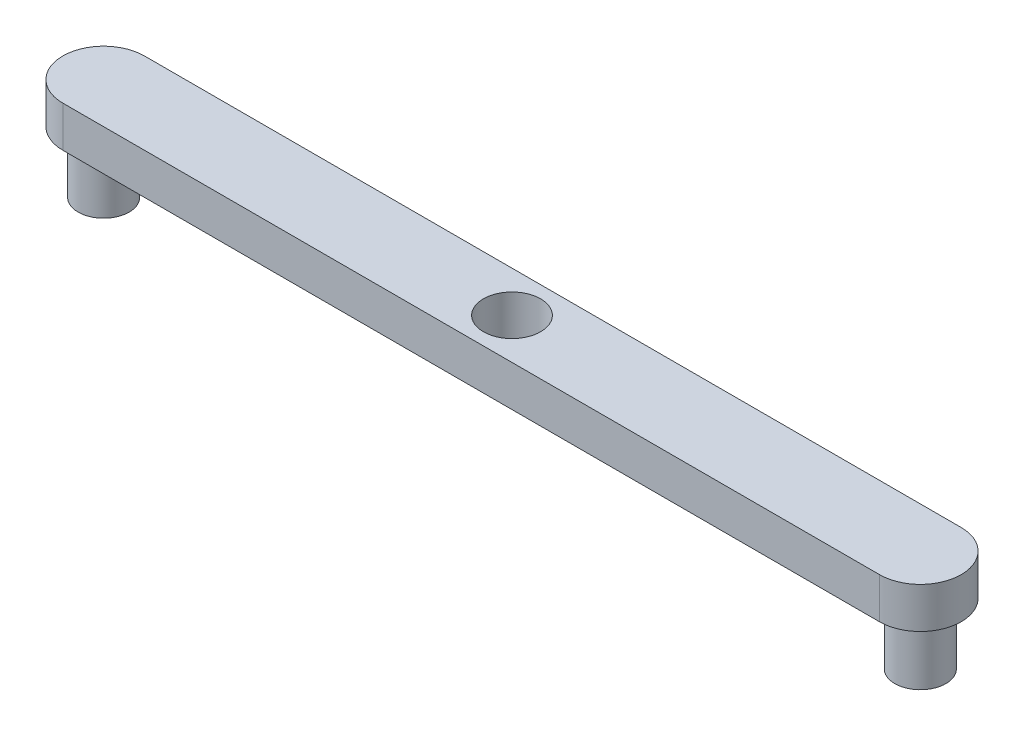
ISO-10303-21;
HEADER;
FILE_DESCRIPTION(('STEP AP214'),'2;1');
FILE_NAME('part.step','',(''),(''),'','','');
FILE_SCHEMA(('AUTOMOTIVE_DESIGN { 1 0 10303 214 1 1 1 1 }'));
ENDSEC;
DATA;
#1=APPLICATION_CONTEXT('core data for automotive mechanical design processes');
#2=APPLICATION_PROTOCOL_DEFINITION('international standard','automotive_design',2000,#1);
#3=PRODUCT_CONTEXT('',#1,'mechanical');
#4=PRODUCT('Part','Part','',(#3));
#5=PRODUCT_RELATED_PRODUCT_CATEGORY('part','',(#4));
#6=PRODUCT_DEFINITION_FORMATION('','',#4);
#7=PRODUCT_DEFINITION_CONTEXT('part definition',#1,'design');
#8=PRODUCT_DEFINITION('design','',#6,#7);
#9=PRODUCT_DEFINITION_SHAPE('','',#8);
#10=(LENGTH_UNIT() NAMED_UNIT(*) SI_UNIT(.MILLI.,.METRE.));
#11=(NAMED_UNIT(*) PLANE_ANGLE_UNIT() SI_UNIT($,.RADIAN.));
#12=(NAMED_UNIT(*) SI_UNIT($,.STERADIAN.) SOLID_ANGLE_UNIT());
#13=UNCERTAINTY_MEASURE_WITH_UNIT(LENGTH_MEASURE(1.E-05),#10,'distance_accuracy_value','');
#14=(GEOMETRIC_REPRESENTATION_CONTEXT(3) GLOBAL_UNCERTAINTY_ASSIGNED_CONTEXT((#13)) GLOBAL_UNIT_ASSIGNED_CONTEXT((#10,
#11,#12)) REPRESENTATION_CONTEXT('',''));
#15=CARTESIAN_POINT('',(0.,0.,0.));
#16=DIRECTION('',(0.,0.,1.));
#17=DIRECTION('',(1.,0.,0.));
#18=AXIS2_PLACEMENT_3D('',#15,#16,#17);
#19=CARTESIAN_POINT('',(-50.8,5.08,0.));
#20=DIRECTION('',(0.,-1.,0.));
#21=DIRECTION('',(0.,0.,-1.));
#22=AXIS2_PLACEMENT_3D('',#19,#20,#21);
#23=CYLINDRICAL_SURFACE('',#22,5.08);
#24=CARTESIAN_POINT('',(-50.8,0.,0.));
#25=DIRECTION('',(0.,1.,0.));
#26=DIRECTION('',(0.,0.,1.));
#27=AXIS2_PLACEMENT_3D('',#24,#25,#26);
#28=CIRCLE('',#27,5.08);
#29=CARTESIAN_POINT('',(-50.8,0.,-5.08));
#30=VERTEX_POINT('',#29);
#31=CARTESIAN_POINT('',(-50.8,0.,5.08));
#32=VERTEX_POINT('',#31);
#33=EDGE_CURVE('E102',#30,#32,#28,.T.);
#34=ORIENTED_EDGE('',*,*,#33,.T.);
#35=DIRECTION('',(0.,-1.,0.));
#36=VECTOR('',#35,1.);
#37=CARTESIAN_POINT('',(-50.8,5.08,5.08));
#38=LINE('',#37,#36);
#39=CARTESIAN_POINT('',(-50.8,5.08,5.08));
#40=VERTEX_POINT('',#39);
#41=EDGE_CURVE('E93',#40,#32,#38,.T.);
#42=ORIENTED_EDGE('',*,*,#41,.F.);
#43=CARTESIAN_POINT('',(-50.8,5.08,0.));
#44=DIRECTION('',(0.,1.,0.));
#45=DIRECTION('',(0.,0.,1.));
#46=AXIS2_PLACEMENT_3D('',#43,#44,#45);
#47=CIRCLE('',#46,5.08);
#48=CARTESIAN_POINT('',(-50.8,5.08,-5.08));
#49=VERTEX_POINT('',#48);
#50=EDGE_CURVE('E87',#49,#40,#47,.T.);
#51=ORIENTED_EDGE('',*,*,#50,.F.);
#52=DIRECTION('',(0.,-1.,0.));
#53=VECTOR('',#52,1.);
#54=CARTESIAN_POINT('',(-50.8,5.08,-5.08));
#55=LINE('',#54,#53);
#56=EDGE_CURVE('E98',#49,#30,#55,.T.);
#57=ORIENTED_EDGE('',*,*,#56,.T.);
#58=EDGE_LOOP('',(#34,#42,#51,#57));
#59=FACE_BOUND('',#58,.T.);
#60=ADVANCED_FACE('F35',(#59),#23,.T.);
#61=CARTESIAN_POINT('',(-50.8,5.08,5.08));
#62=DIRECTION('',(0.,0.,-1.));
#63=DIRECTION('',(-1.,0.,0.));
#64=AXIS2_PLACEMENT_3D('',#61,#62,#63);
#65=PLANE('',#64);
#66=DIRECTION('',(1.,0.,0.));
#67=VECTOR('',#66,1.);
#68=CARTESIAN_POINT('',(-50.8,0.,5.08));
#69=LINE('',#68,#67);
#70=CARTESIAN_POINT('',(50.8,0.,5.08));
#71=VERTEX_POINT('',#70);
#72=EDGE_CURVE('E92',#32,#71,#69,.T.);
#73=ORIENTED_EDGE('',*,*,#72,.T.);
#74=DIRECTION('',(0.,-1.,0.));
#75=VECTOR('',#74,1.);
#76=CARTESIAN_POINT('',(50.8,5.08,5.08));
#77=LINE('',#76,#75);
#78=CARTESIAN_POINT('',(50.8,5.08,5.08));
#79=VERTEX_POINT('',#78);
#80=EDGE_CURVE('E90',#79,#71,#77,.T.);
#81=ORIENTED_EDGE('',*,*,#80,.F.);
#82=DIRECTION('',(1.,0.,0.));
#83=VECTOR('',#82,1.);
#84=CARTESIAN_POINT('',(-50.8,5.08,5.08));
#85=LINE('',#84,#83);
#86=EDGE_CURVE('E82',#40,#79,#85,.T.);
#87=ORIENTED_EDGE('',*,*,#86,.F.);
#88=ORIENTED_EDGE('',*,*,#41,.T.);
#89=EDGE_LOOP('',(#73,#81,#87,#88));
#90=FACE_BOUND('',#89,.T.);
#91=ADVANCED_FACE('F91',(#90),#65,.F.);
#92=CARTESIAN_POINT('',(50.8,5.08,0.));
#93=DIRECTION('',(0.,-1.,0.));
#94=DIRECTION('',(0.,0.,-1.));
#95=AXIS2_PLACEMENT_3D('',#92,#93,#94);
#96=CYLINDRICAL_SURFACE('',#95,5.08);
#97=CARTESIAN_POINT('',(50.8,0.,0.));
#98=DIRECTION('',(0.,1.,0.));
#99=DIRECTION('',(0.,0.,1.));
#100=AXIS2_PLACEMENT_3D('',#97,#98,#99);
#101=CIRCLE('',#100,5.08);
#102=CARTESIAN_POINT('',(50.8,0.,-5.08));
#103=VERTEX_POINT('',#102);
#104=EDGE_CURVE('E68',#71,#103,#101,.T.);
#105=ORIENTED_EDGE('',*,*,#104,.T.);
#106=DIRECTION('',(0.,-1.,0.));
#107=VECTOR('',#106,1.);
#108=CARTESIAN_POINT('',(50.8,5.08,-5.08));
#109=LINE('',#108,#107);
#110=CARTESIAN_POINT('',(50.8,5.08,-5.08));
#111=VERTEX_POINT('',#110);
#112=EDGE_CURVE('E94',#111,#103,#109,.T.);
#113=ORIENTED_EDGE('',*,*,#112,.F.);
#114=CARTESIAN_POINT('',(50.8,5.08,0.));
#115=DIRECTION('',(0.,1.,0.));
#116=DIRECTION('',(0.,0.,1.));
#117=AXIS2_PLACEMENT_3D('',#114,#115,#116);
#118=CIRCLE('',#117,5.08);
#119=EDGE_CURVE('E85',#79,#111,#118,.T.);
#120=ORIENTED_EDGE('',*,*,#119,.F.);
#121=ORIENTED_EDGE('',*,*,#80,.T.);
#122=EDGE_LOOP('',(#105,#113,#120,#121));
#123=FACE_BOUND('',#122,.T.);
#124=ADVANCED_FACE('F96',(#123),#96,.T.);
#125=CARTESIAN_POINT('',(-50.8,5.08,-5.08));
#126=DIRECTION('',(0.,0.,1.));
#127=DIRECTION('',(1.,0.,0.));
#128=AXIS2_PLACEMENT_3D('',#125,#126,#127);
#129=PLANE('',#128);
#130=DIRECTION('',(-1.,0.,0.));
#131=VECTOR('',#130,1.);
#132=CARTESIAN_POINT('',(-50.8,0.,-5.08));
#133=LINE('',#132,#131);
#134=EDGE_CURVE('E74',#103,#30,#133,.T.);
#135=ORIENTED_EDGE('',*,*,#134,.T.);
#136=ORIENTED_EDGE('',*,*,#56,.F.);
#137=DIRECTION('',(-1.,0.,0.));
#138=VECTOR('',#137,1.);
#139=CARTESIAN_POINT('',(-50.8,5.08,-5.08));
#140=LINE('',#139,#138);
#141=EDGE_CURVE('E51',#111,#49,#140,.T.);
#142=ORIENTED_EDGE('',*,*,#141,.F.);
#143=ORIENTED_EDGE('',*,*,#112,.T.);
#144=EDGE_LOOP('',(#135,#136,#142,#143));
#145=FACE_BOUND('',#144,.T.);
#146=ADVANCED_FACE('F123',(#145),#129,.F.);
#147=CARTESIAN_POINT('',(-50.8,5.08,0.));
#148=DIRECTION('',(0.,1.,0.));
#149=DIRECTION('',(0.,0.,1.));
#150=AXIS2_PLACEMENT_3D('',#147,#148,#149);
#151=PLANE('',#150);
#152=CARTESIAN_POINT('',(0.,5.08,0.));
#153=DIRECTION('',(0.,1.,0.));
#154=DIRECTION('',(0.,0.,1.));
#155=AXIS2_PLACEMENT_3D('',#152,#153,#154);
#156=CIRCLE('',#155,3.556);
#157=CARTESIAN_POINT('',(0.,5.08,3.556));
#158=VERTEX_POINT('',#157);
#159=EDGE_CURVE('E215',#158,#158,#156,.T.);
#160=ORIENTED_EDGE('',*,*,#159,.F.);
#161=EDGE_LOOP('',(#160));
#162=FACE_BOUND('',#161,.T.);
#163=ORIENTED_EDGE('',*,*,#50,.T.);
#164=ORIENTED_EDGE('',*,*,#86,.T.);
#165=ORIENTED_EDGE('',*,*,#119,.T.);
#166=ORIENTED_EDGE('',*,*,#141,.T.);
#167=EDGE_LOOP('',(#163,#164,#165,#166));
#168=FACE_BOUND('',#167,.T.);
#169=ADVANCED_FACE('F83',(#162,#168),#151,.T.);
#170=CARTESIAN_POINT('',(-50.8,0.,0.));
#171=DIRECTION('',(0.,1.,0.));
#172=DIRECTION('',(0.,0.,1.));
#173=AXIS2_PLACEMENT_3D('',#170,#171,#172);
#174=PLANE('',#173);
#175=CARTESIAN_POINT('',(0.,0.,0.));
#176=DIRECTION('',(0.,1.,0.));
#177=DIRECTION('',(0.,0.,1.));
#178=AXIS2_PLACEMENT_3D('',#175,#176,#177);
#179=CIRCLE('',#178,3.556);
#180=CARTESIAN_POINT('',(0.,0.,3.556));
#181=VERTEX_POINT('',#180);
#182=EDGE_CURVE('E218',#181,#181,#179,.T.);
#183=ORIENTED_EDGE('',*,*,#182,.T.);
#184=EDGE_LOOP('',(#183));
#185=FACE_BOUND('',#184,.T.);
#186=CARTESIAN_POINT('',(50.8,0.,0.));
#187=DIRECTION('',(0.,1.,0.));
#188=DIRECTION('',(0.,0.,1.));
#189=AXIS2_PLACEMENT_3D('',#186,#187,#188);
#190=CIRCLE('',#189,3.175);
#191=CARTESIAN_POINT('',(50.8,0.,3.175));
#192=VERTEX_POINT('',#191);
#193=EDGE_CURVE('E11',#192,#192,#190,.F.);
#194=ORIENTED_EDGE('',*,*,#193,.F.);
#195=EDGE_LOOP('',(#194));
#196=FACE_BOUND('',#195,.T.);
#197=CARTESIAN_POINT('',(-50.8,0.,0.));
#198=DIRECTION('',(0.,1.,0.));
#199=DIRECTION('',(0.,0.,1.));
#200=AXIS2_PLACEMENT_3D('',#197,#198,#199);
#201=CIRCLE('',#200,3.175);
#202=CARTESIAN_POINT('',(-50.8,0.,3.175));
#203=VERTEX_POINT('',#202);
#204=EDGE_CURVE('E43',#203,#203,#201,.F.);
#205=ORIENTED_EDGE('',*,*,#204,.F.);
#206=EDGE_LOOP('',(#205));
#207=FACE_BOUND('',#206,.T.);
#208=ORIENTED_EDGE('',*,*,#33,.F.);
#209=ORIENTED_EDGE('',*,*,#134,.F.);
#210=ORIENTED_EDGE('',*,*,#104,.F.);
#211=ORIENTED_EDGE('',*,*,#72,.F.);
#212=EDGE_LOOP('',(#208,#209,#210,#211));
#213=FACE_BOUND('',#212,.T.);
#214=ADVANCED_FACE('F116',(#185,#196,#207,#213),#174,.F.);
#215=CARTESIAN_POINT('',(-50.8,-7.62,0.));
#216=DIRECTION('',(0.,1.,0.));
#217=DIRECTION('',(0.,0.,1.));
#218=AXIS2_PLACEMENT_3D('',#215,#216,#217);
#219=CYLINDRICAL_SURFACE('',#218,3.175);
#220=CARTESIAN_POINT('',(-50.8,-7.62,0.));
#221=DIRECTION('',(0.,-1.,0.));
#222=DIRECTION('',(0.,0.,-1.));
#223=AXIS2_PLACEMENT_3D('',#220,#221,#222);
#224=CIRCLE('',#223,3.175);
#225=CARTESIAN_POINT('',(-50.8,-7.62,3.175));
#226=VERTEX_POINT('',#225);
#227=EDGE_CURVE('E105',#226,#226,#224,.T.);
#228=CARTESIAN_POINT('',(-50.8,-7.62,3.175));
#229=CARTESIAN_POINT('',(-50.8,-7.540625,3.175));
#230=CARTESIAN_POINT('',(-50.8,-7.46125,3.175));
#231=CARTESIAN_POINT('',(-50.8,-7.3025,3.175));
#232=CARTESIAN_POINT('',(-50.8,-7.223125,3.175));
#233=CARTESIAN_POINT('',(-50.8,-7.064375,3.175));
#234=CARTESIAN_POINT('',(-50.8,-6.985,3.175));
#235=CARTESIAN_POINT('',(-50.8,-6.82625,3.175));
#236=CARTESIAN_POINT('',(-50.8,-6.746875,3.175));
#237=CARTESIAN_POINT('',(-50.8,-6.588125,3.175));
#238=CARTESIAN_POINT('',(-50.8,-6.50875,3.175));
#239=CARTESIAN_POINT('',(-50.8,-6.35,3.175));
#240=CARTESIAN_POINT('',(-50.8,-6.270625,3.175));
#241=CARTESIAN_POINT('',(-50.8,-6.111875,3.175));
#242=CARTESIAN_POINT('',(-50.8,-6.0325,3.175));
#243=CARTESIAN_POINT('',(-50.8,-5.87375,3.175));
#244=CARTESIAN_POINT('',(-50.8,-5.794375,3.175));
#245=CARTESIAN_POINT('',(-50.8,-5.635625,3.175));
#246=CARTESIAN_POINT('',(-50.8,-5.55625,3.175));
#247=CARTESIAN_POINT('',(-50.8,-5.3975,3.175));
#248=CARTESIAN_POINT('',(-50.8,-5.318125,3.175));
#249=CARTESIAN_POINT('',(-50.8,-5.159375,3.175));
#250=CARTESIAN_POINT('',(-50.8,-5.08,3.175));
#251=CARTESIAN_POINT('',(-50.8,-4.92125,3.175));
#252=CARTESIAN_POINT('',(-50.8,-4.841875,3.175));
#253=CARTESIAN_POINT('',(-50.8,-4.683125,3.175));
#254=CARTESIAN_POINT('',(-50.8,-4.60375,3.175));
#255=CARTESIAN_POINT('',(-50.8,-4.445,3.175));
#256=CARTESIAN_POINT('',(-50.8,-4.365625,3.175));
#257=CARTESIAN_POINT('',(-50.8,-4.206875,3.175));
#258=CARTESIAN_POINT('',(-50.8,-4.1275,3.175));
#259=CARTESIAN_POINT('',(-50.8,-3.96875,3.175));
#260=CARTESIAN_POINT('',(-50.8,-3.889375,3.175));
#261=CARTESIAN_POINT('',(-50.8,-3.730625,3.175));
#262=CARTESIAN_POINT('',(-50.8,-3.65125,3.175));
#263=CARTESIAN_POINT('',(-50.8,-3.4925,3.175));
#264=CARTESIAN_POINT('',(-50.8,-3.413125,3.175));
#265=CARTESIAN_POINT('',(-50.8,-3.254375,3.175));
#266=CARTESIAN_POINT('',(-50.8,-3.175,3.175));
#267=CARTESIAN_POINT('',(-50.8,-3.01625,3.175));
#268=CARTESIAN_POINT('',(-50.8,-2.936875,3.175));
#269=CARTESIAN_POINT('',(-50.8,-2.778125,3.175));
#270=CARTESIAN_POINT('',(-50.8,-2.69875,3.175));
#271=CARTESIAN_POINT('',(-50.8,-2.54,3.175));
#272=CARTESIAN_POINT('',(-50.8,-2.460625,3.175));
#273=CARTESIAN_POINT('',(-50.8,-2.301875,3.175));
#274=CARTESIAN_POINT('',(-50.8,-2.2225,3.175));
#275=CARTESIAN_POINT('',(-50.8,-2.06375,3.175));
#276=CARTESIAN_POINT('',(-50.8,-1.984375,3.175));
#277=CARTESIAN_POINT('',(-50.8,-1.825625,3.175));
#278=CARTESIAN_POINT('',(-50.8,-1.74625,3.175));
#279=CARTESIAN_POINT('',(-50.8,-1.5875,3.175));
#280=CARTESIAN_POINT('',(-50.8,-1.508125,3.175));
#281=CARTESIAN_POINT('',(-50.8,-1.349375,3.175));
#282=CARTESIAN_POINT('',(-50.8,-1.27,3.175));
#283=CARTESIAN_POINT('',(-50.8,-1.11125,3.175));
#284=CARTESIAN_POINT('',(-50.8,-1.031875,3.175));
#285=CARTESIAN_POINT('',(-50.8,-0.873125,3.175));
#286=CARTESIAN_POINT('',(-50.8,-0.79375,3.175));
#287=CARTESIAN_POINT('',(-50.8,-0.635,3.175));
#288=CARTESIAN_POINT('',(-50.8,-0.555625,3.175));
#289=CARTESIAN_POINT('',(-50.8,-0.396875,3.175));
#290=CARTESIAN_POINT('',(-50.8,-0.3175,3.175));
#291=CARTESIAN_POINT('',(-50.8,-0.15875,3.175));
#292=CARTESIAN_POINT('',(-50.8,-0.0793749999999999,3.175));
#293=CARTESIAN_POINT('',(-50.8,0.,3.175));
#294=B_SPLINE_CURVE_WITH_KNOTS('',3,(#228,#229,#230,#231,#232,#233,#234,#235,#236,#237,#238,
#239,#240,#241,#242,#243,#244,#245,#246,#247,#248,#249,#250,#251,#252,#253,#254,#255,#256,#257,
#258,#259,#260,#261,#262,#263,#264,#265,#266,#267,#268,#269,#270,#271,#272,#273,#274,#275,#276,
#277,#278,#279,#280,#281,#282,#283,#284,#285,#286,#287,#288,#289,#290,#291,#292,#293),
.UNSPECIFIED.,.F.,.F.,(4,2,2,2,2,2,2,2,2,2,2,2,2,2,2,2,2,2,2,2,2,2,2,2,2,2,2,2,2,2,2,2,4),(0.,
0.238125,0.47625,0.714375000000001,0.9525,1.190625,1.42875,1.666875,1.905,2.143125,2.38125,
2.619375,2.8575,3.095625,3.33375,3.571875,3.81,4.048125,4.28625,4.524375,4.7625,5.000625,
5.23875,5.476875,5.715,5.953125,6.19125,6.429375,6.6675,6.905625,7.14375,7.381875,7.62),.UNSPECIFIED.);
#295=EDGE_CURVE('BSEAM114',#226,#203,#294,.T.);
#296=ORIENTED_EDGE('',*,*,#227,.F.);
#297=ORIENTED_EDGE('',*,*,#204,.T.);
#298=ORIENTED_EDGE('',*,*,#295,.T.);
#299=ORIENTED_EDGE('',*,*,#295,.F.);
#300=EDGE_LOOP('',(#296,#298,#297,#299));
#301=FACE_BOUND('',#300,.T.);
#302=ADVANCED_FACE('F114',(#301),#219,.T.);
#303=CARTESIAN_POINT('',(-50.8,-7.62,0.));
#304=DIRECTION('',(0.,-1.,0.));
#305=DIRECTION('',(0.,0.,-1.));
#306=AXIS2_PLACEMENT_3D('',#303,#304,#305);
#307=PLANE('',#306);
#308=ORIENTED_EDGE('',*,*,#227,.T.);
#309=EDGE_LOOP('',(#308));
#310=FACE_BOUND('',#309,.T.);
#311=ADVANCED_FACE('F157',(#310),#307,.T.);
#312=CARTESIAN_POINT('',(50.8,-7.62,0.));
#313=DIRECTION('',(0.,1.,0.));
#314=DIRECTION('',(0.,0.,1.));
#315=AXIS2_PLACEMENT_3D('',#312,#313,#314);
#316=CYLINDRICAL_SURFACE('',#315,3.175);
#317=CARTESIAN_POINT('',(50.8,-7.62,0.));
#318=DIRECTION('',(0.,-1.,0.));
#319=DIRECTION('',(0.,0.,-1.));
#320=AXIS2_PLACEMENT_3D('',#317,#318,#319);
#321=CIRCLE('',#320,3.175);
#322=CARTESIAN_POINT('',(50.8,-7.62,3.175));
#323=VERTEX_POINT('',#322);
#324=EDGE_CURVE('E220',#323,#323,#321,.T.);
#325=CARTESIAN_POINT('',(50.8,-7.62,3.175));
#326=CARTESIAN_POINT('',(50.8,-7.540625,3.175));
#327=CARTESIAN_POINT('',(50.8,-7.46125,3.175));
#328=CARTESIAN_POINT('',(50.8,-7.3025,3.175));
#329=CARTESIAN_POINT('',(50.8,-7.223125,3.175));
#330=CARTESIAN_POINT('',(50.8,-7.064375,3.175));
#331=CARTESIAN_POINT('',(50.8,-6.985,3.175));
#332=CARTESIAN_POINT('',(50.8,-6.82625,3.175));
#333=CARTESIAN_POINT('',(50.8,-6.746875,3.175));
#334=CARTESIAN_POINT('',(50.8,-6.588125,3.175));
#335=CARTESIAN_POINT('',(50.8,-6.50875,3.175));
#336=CARTESIAN_POINT('',(50.8,-6.35,3.175));
#337=CARTESIAN_POINT('',(50.8,-6.270625,3.175));
#338=CARTESIAN_POINT('',(50.8,-6.111875,3.175));
#339=CARTESIAN_POINT('',(50.8,-6.0325,3.175));
#340=CARTESIAN_POINT('',(50.8,-5.87375,3.175));
#341=CARTESIAN_POINT('',(50.8,-5.794375,3.175));
#342=CARTESIAN_POINT('',(50.8,-5.635625,3.175));
#343=CARTESIAN_POINT('',(50.8,-5.55625,3.175));
#344=CARTESIAN_POINT('',(50.8,-5.3975,3.175));
#345=CARTESIAN_POINT('',(50.8,-5.318125,3.175));
#346=CARTESIAN_POINT('',(50.8,-5.159375,3.175));
#347=CARTESIAN_POINT('',(50.8,-5.08,3.175));
#348=CARTESIAN_POINT('',(50.8,-4.92125,3.175));
#349=CARTESIAN_POINT('',(50.8,-4.841875,3.175));
#350=CARTESIAN_POINT('',(50.8,-4.683125,3.175));
#351=CARTESIAN_POINT('',(50.8,-4.60375,3.175));
#352=CARTESIAN_POINT('',(50.8,-4.445,3.175));
#353=CARTESIAN_POINT('',(50.8,-4.365625,3.175));
#354=CARTESIAN_POINT('',(50.8,-4.206875,3.175));
#355=CARTESIAN_POINT('',(50.8,-4.1275,3.175));
#356=CARTESIAN_POINT('',(50.8,-3.96875,3.175));
#357=CARTESIAN_POINT('',(50.8,-3.889375,3.175));
#358=CARTESIAN_POINT('',(50.8,-3.730625,3.175));
#359=CARTESIAN_POINT('',(50.8,-3.65125,3.175));
#360=CARTESIAN_POINT('',(50.8,-3.4925,3.175));
#361=CARTESIAN_POINT('',(50.8,-3.413125,3.175));
#362=CARTESIAN_POINT('',(50.8,-3.254375,3.175));
#363=CARTESIAN_POINT('',(50.8,-3.175,3.175));
#364=CARTESIAN_POINT('',(50.8,-3.01625,3.175));
#365=CARTESIAN_POINT('',(50.8,-2.936875,3.175));
#366=CARTESIAN_POINT('',(50.8,-2.778125,3.175));
#367=CARTESIAN_POINT('',(50.8,-2.69875,3.175));
#368=CARTESIAN_POINT('',(50.8,-2.54,3.175));
#369=CARTESIAN_POINT('',(50.8,-2.460625,3.175));
#370=CARTESIAN_POINT('',(50.8,-2.301875,3.175));
#371=CARTESIAN_POINT('',(50.8,-2.2225,3.175));
#372=CARTESIAN_POINT('',(50.8,-2.06375,3.175));
#373=CARTESIAN_POINT('',(50.8,-1.984375,3.175));
#374=CARTESIAN_POINT('',(50.8,-1.825625,3.175));
#375=CARTESIAN_POINT('',(50.8,-1.74625,3.175));
#376=CARTESIAN_POINT('',(50.8,-1.5875,3.175));
#377=CARTESIAN_POINT('',(50.8,-1.508125,3.175));
#378=CARTESIAN_POINT('',(50.8,-1.349375,3.175));
#379=CARTESIAN_POINT('',(50.8,-1.27,3.175));
#380=CARTESIAN_POINT('',(50.8,-1.11125,3.175));
#381=CARTESIAN_POINT('',(50.8,-1.031875,3.175));
#382=CARTESIAN_POINT('',(50.8,-0.873125,3.175));
#383=CARTESIAN_POINT('',(50.8,-0.79375,3.175));
#384=CARTESIAN_POINT('',(50.8,-0.635,3.175));
#385=CARTESIAN_POINT('',(50.8,-0.555625,3.175));
#386=CARTESIAN_POINT('',(50.8,-0.396875,3.175));
#387=CARTESIAN_POINT('',(50.8,-0.3175,3.175));
#388=CARTESIAN_POINT('',(50.8,-0.15875,3.175));
#389=CARTESIAN_POINT('',(50.8,-0.0793749999999999,3.175));
#390=CARTESIAN_POINT('',(50.8,0.,3.175));
#391=B_SPLINE_CURVE_WITH_KNOTS('',3,(#325,#326,#327,#328,#329,#330,#331,#332,#333,#334,#335,
#336,#337,#338,#339,#340,#341,#342,#343,#344,#345,#346,#347,#348,#349,#350,#351,#352,#353,#354,
#355,#356,#357,#358,#359,#360,#361,#362,#363,#364,#365,#366,#367,#368,#369,#370,#371,#372,#373,
#374,#375,#376,#377,#378,#379,#380,#381,#382,#383,#384,#385,#386,#387,#388,#389,#390),
.UNSPECIFIED.,.F.,.F.,(4,2,2,2,2,2,2,2,2,2,2,2,2,2,2,2,2,2,2,2,2,2,2,2,2,2,2,2,2,2,2,2,4),(0.,
0.238125,0.47625,0.714375000000001,0.9525,1.190625,1.42875,1.666875,1.905,2.143125,2.38125,
2.619375,2.8575,3.095625,3.33375,3.571875,3.81,4.048125,4.28625,4.524375,4.7625,5.000625,
5.23875,5.476875,5.715,5.953125,6.19125,6.429375,6.6675,6.905625,7.14375,7.381875,7.62),.UNSPECIFIED.);
#392=EDGE_CURVE('BSEAM168',#323,#192,#391,.T.);
#393=ORIENTED_EDGE('',*,*,#324,.F.);
#394=ORIENTED_EDGE('',*,*,#193,.T.);
#395=ORIENTED_EDGE('',*,*,#392,.T.);
#396=ORIENTED_EDGE('',*,*,#392,.F.);
#397=EDGE_LOOP('',(#393,#395,#394,#396));
#398=FACE_BOUND('',#397,.T.);
#399=ADVANCED_FACE('F168',(#398),#316,.T.);
#400=CARTESIAN_POINT('',(50.8,-7.62,0.));
#401=DIRECTION('',(0.,-1.,0.));
#402=DIRECTION('',(0.,0.,-1.));
#403=AXIS2_PLACEMENT_3D('',#400,#401,#402);
#404=PLANE('',#403);
#405=ORIENTED_EDGE('',*,*,#324,.T.);
#406=EDGE_LOOP('',(#405));
#407=FACE_BOUND('',#406,.T.);
#408=ADVANCED_FACE('F178',(#407),#404,.T.);
#409=CARTESIAN_POINT('',(0.,5.08,0.));
#410=DIRECTION('',(0.,-1.,0.));
#411=DIRECTION('',(0.,0.,-1.));
#412=AXIS2_PLACEMENT_3D('',#409,#410,#411);
#413=CYLINDRICAL_SURFACE('',#412,3.556);
#414=ORIENTED_EDGE('',*,*,#159,.T.);
#415=EDGE_LOOP('',(#414));
#416=FACE_BOUND('',#415,.T.);
#417=ORIENTED_EDGE('',*,*,#182,.F.);
#418=EDGE_LOOP('',(#417));
#419=FACE_BOUND('',#418,.T.);
#420=ADVANCED_FACE('F188',(#416,#419),#413,.F.);
#421=CLOSED_SHELL('',(#60,#91,#124,#146,#169,#214,#302,#311,#399,#408,#420));
#422=MANIFOLD_SOLID_BREP('B2',#421);
#423=ADVANCED_BREP_SHAPE_REPRESENTATION('',(#18,#422),#14);
#424=SHAPE_DEFINITION_REPRESENTATION(#9,#423);
ENDSEC;
END-ISO-10303-21;
